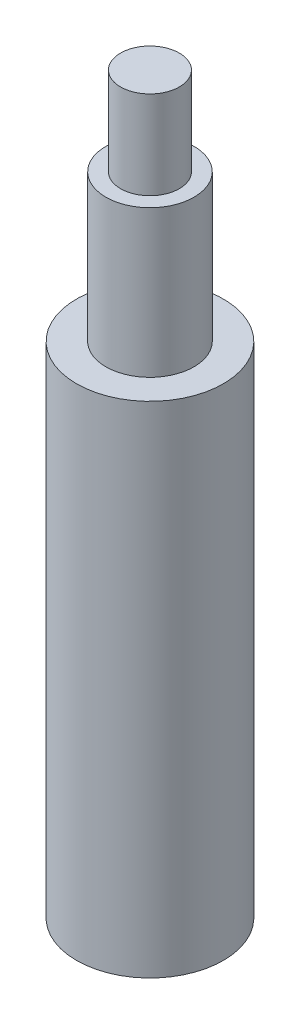
ISO-10303-21;
HEADER;
FILE_DESCRIPTION(('STEP AP214'),'2;1');
FILE_NAME('part.step','',(''),(''),'','','');
FILE_SCHEMA(('AUTOMOTIVE_DESIGN { 1 0 10303 214 1 1 1 1 }'));
ENDSEC;
DATA;
#1=APPLICATION_CONTEXT('core data for automotive mechanical design processes');
#2=APPLICATION_PROTOCOL_DEFINITION('international standard','automotive_design',2000,#1);
#3=PRODUCT_CONTEXT('',#1,'mechanical');
#4=PRODUCT('Part','Part','',(#3));
#5=PRODUCT_RELATED_PRODUCT_CATEGORY('part','',(#4));
#6=PRODUCT_DEFINITION_FORMATION('','',#4);
#7=PRODUCT_DEFINITION_CONTEXT('part definition',#1,'design');
#8=PRODUCT_DEFINITION('design','',#6,#7);
#9=PRODUCT_DEFINITION_SHAPE('','',#8);
#10=(LENGTH_UNIT() NAMED_UNIT(*) SI_UNIT(.MILLI.,.METRE.));
#11=(NAMED_UNIT(*) PLANE_ANGLE_UNIT() SI_UNIT($,.RADIAN.));
#12=(NAMED_UNIT(*) SI_UNIT($,.STERADIAN.) SOLID_ANGLE_UNIT());
#13=UNCERTAINTY_MEASURE_WITH_UNIT(LENGTH_MEASURE(1.E-05),#10,'distance_accuracy_value','');
#14=(GEOMETRIC_REPRESENTATION_CONTEXT(3) GLOBAL_UNCERTAINTY_ASSIGNED_CONTEXT((#13)) GLOBAL_UNIT_ASSIGNED_CONTEXT((#10,
#11,#12)) REPRESENTATION_CONTEXT('',''));
#15=CARTESIAN_POINT('',(0.,0.,0.));
#16=DIRECTION('',(0.,0.,1.));
#17=DIRECTION('',(1.,0.,0.));
#18=AXIS2_PLACEMENT_3D('',#15,#16,#17);
#19=CARTESIAN_POINT('',(-20.2916512459885,134.,0.));
#20=DIRECTION('',(0.,1.,0.));
#21=DIRECTION('',(0.,0.,1.));
#22=AXIS2_PLACEMENT_3D('',#19,#20,#21);
#23=CYLINDRICAL_SURFACE('',#22,2.);
#24=CARTESIAN_POINT('',(-20.2916512459885,134.,0.));
#25=DIRECTION('',(0.,1.,0.));
#26=DIRECTION('',(0.,0.,1.));
#27=AXIS2_PLACEMENT_3D('',#24,#25,#26);
#28=CIRCLE('',#27,2.);
#29=CARTESIAN_POINT('',(-20.2916512459885,134.,2.));
#30=VERTEX_POINT('',#29);
#31=EDGE_CURVE('E43',#30,#30,#28,.T.);
#32=ORIENTED_EDGE('',*,*,#31,.T.);
#33=EDGE_LOOP('',(#32));
#34=FACE_BOUND('',#33,.T.);
#35=CARTESIAN_POINT('',(-20.2916512459885,140.,0.));
#36=DIRECTION('',(0.,1.,0.));
#37=DIRECTION('',(0.,0.,1.));
#38=AXIS2_PLACEMENT_3D('',#35,#36,#37);
#39=CIRCLE('',#38,2.);
#40=CARTESIAN_POINT('',(-20.2916512459885,140.,2.));
#41=VERTEX_POINT('',#40);
#42=EDGE_CURVE('E10',#41,#41,#39,.T.);
#43=ORIENTED_EDGE('',*,*,#42,.F.);
#44=EDGE_LOOP('',(#43));
#45=FACE_BOUND('',#44,.T.);
#46=ADVANCED_FACE('F40',(#34,#45),#23,.T.);
#47=CARTESIAN_POINT('',(-20.2916512459885,140.,0.));
#48=DIRECTION('',(0.,1.,0.));
#49=DIRECTION('',(0.,0.,1.));
#50=AXIS2_PLACEMENT_3D('',#47,#48,#49);
#51=PLANE('',#50);
#52=ORIENTED_EDGE('',*,*,#42,.T.);
#53=EDGE_LOOP('',(#52));
#54=FACE_BOUND('',#53,.T.);
#55=ADVANCED_FACE('F78',(#54),#51,.T.);
#56=CARTESIAN_POINT('',(-20.2916512459885,124.,0.));
#57=DIRECTION('',(0.,1.,0.));
#58=DIRECTION('',(0.,0.,1.));
#59=AXIS2_PLACEMENT_3D('',#56,#57,#58);
#60=CYLINDRICAL_SURFACE('',#59,3.);
#61=CARTESIAN_POINT('',(-20.2916512459885,124.,0.));
#62=DIRECTION('',(0.,1.,0.));
#63=DIRECTION('',(0.,0.,1.));
#64=AXIS2_PLACEMENT_3D('',#61,#62,#63);
#65=CIRCLE('',#64,3.);
#66=CARTESIAN_POINT('',(-20.2916512459885,124.,3.));
#67=VERTEX_POINT('',#66);
#68=EDGE_CURVE('E51',#67,#67,#65,.T.);
#69=ORIENTED_EDGE('',*,*,#68,.T.);
#70=EDGE_LOOP('',(#69));
#71=FACE_BOUND('',#70,.T.);
#72=CARTESIAN_POINT('',(-20.2916512459885,134.,0.));
#73=DIRECTION('',(0.,1.,0.));
#74=DIRECTION('',(0.,0.,1.));
#75=AXIS2_PLACEMENT_3D('',#72,#73,#74);
#76=CIRCLE('',#75,3.);
#77=CARTESIAN_POINT('',(-20.2916512459885,134.,3.));
#78=VERTEX_POINT('',#77);
#79=EDGE_CURVE('E50',#78,#78,#76,.T.);
#80=ORIENTED_EDGE('',*,*,#79,.F.);
#81=EDGE_LOOP('',(#80));
#82=FACE_BOUND('',#81,.T.);
#83=ADVANCED_FACE('F84',(#71,#82),#60,.T.);
#84=CARTESIAN_POINT('',(-20.2916512459885,134.,0.));
#85=DIRECTION('',(0.,1.,0.));
#86=DIRECTION('',(0.,0.,1.));
#87=AXIS2_PLACEMENT_3D('',#84,#85,#86);
#88=PLANE('',#87);
#89=ORIENTED_EDGE('',*,*,#31,.F.);
#90=EDGE_LOOP('',(#89));
#91=FACE_BOUND('',#90,.T.);
#92=ORIENTED_EDGE('',*,*,#79,.T.);
#93=EDGE_LOOP('',(#92));
#94=FACE_BOUND('',#93,.T.);
#95=ADVANCED_FACE('F76',(#91,#94),#88,.T.);
#96=CARTESIAN_POINT('',(-20.2916512459885,90.,0.));
#97=DIRECTION('',(0.,1.,0.));
#98=DIRECTION('',(0.,0.,1.));
#99=AXIS2_PLACEMENT_3D('',#96,#97,#98);
#100=CYLINDRICAL_SURFACE('',#99,5.);
#101=CARTESIAN_POINT('',(-20.2916512459885,90.,0.));
#102=DIRECTION('',(0.,1.,0.));
#103=DIRECTION('',(0.,0.,1.));
#104=AXIS2_PLACEMENT_3D('',#101,#102,#103);
#105=CIRCLE('',#104,5.);
#106=CARTESIAN_POINT('',(-20.2916512459885,90.,5.));
#107=VERTEX_POINT('',#106);
#108=EDGE_CURVE('E57',#107,#107,#105,.T.);
#109=ORIENTED_EDGE('',*,*,#108,.T.);
#110=EDGE_LOOP('',(#109));
#111=FACE_BOUND('',#110,.T.);
#112=CARTESIAN_POINT('',(-20.2916512459885,124.,0.));
#113=DIRECTION('',(0.,1.,0.));
#114=DIRECTION('',(0.,0.,1.));
#115=AXIS2_PLACEMENT_3D('',#112,#113,#114);
#116=CIRCLE('',#115,5.);
#117=CARTESIAN_POINT('',(-20.2916512459885,124.,5.));
#118=VERTEX_POINT('',#117);
#119=EDGE_CURVE('E60',#118,#118,#116,.T.);
#120=ORIENTED_EDGE('',*,*,#119,.F.);
#121=EDGE_LOOP('',(#120));
#122=FACE_BOUND('',#121,.T.);
#123=ADVANCED_FACE('F64',(#111,#122),#100,.T.);
#124=CARTESIAN_POINT('',(-20.2916512459885,90.,0.));
#125=DIRECTION('',(0.,1.,0.));
#126=DIRECTION('',(0.,0.,1.));
#127=AXIS2_PLACEMENT_3D('',#124,#125,#126);
#128=PLANE('',#127);
#129=ORIENTED_EDGE('',*,*,#108,.F.);
#130=EDGE_LOOP('',(#129));
#131=FACE_BOUND('',#130,.T.);
#132=ADVANCED_FACE('F67',(#131),#128,.F.);
#133=CARTESIAN_POINT('',(-20.2916512459885,124.,0.));
#134=DIRECTION('',(0.,1.,0.));
#135=DIRECTION('',(0.,0.,1.));
#136=AXIS2_PLACEMENT_3D('',#133,#134,#135);
#137=PLANE('',#136);
#138=ORIENTED_EDGE('',*,*,#68,.F.);
#139=EDGE_LOOP('',(#138));
#140=FACE_BOUND('',#139,.T.);
#141=ORIENTED_EDGE('',*,*,#119,.T.);
#142=EDGE_LOOP('',(#141));
#143=FACE_BOUND('',#142,.T.);
#144=ADVANCED_FACE('F69',(#140,#143),#137,.T.);
#145=CLOSED_SHELL('',(#46,#55,#83,#95,#123,#132,#144));
#146=MANIFOLD_SOLID_BREP('B2',#145);
#147=ADVANCED_BREP_SHAPE_REPRESENTATION('',(#18,#146),#14);
#148=SHAPE_DEFINITION_REPRESENTATION(#9,#147);
ENDSEC;
END-ISO-10303-21;
